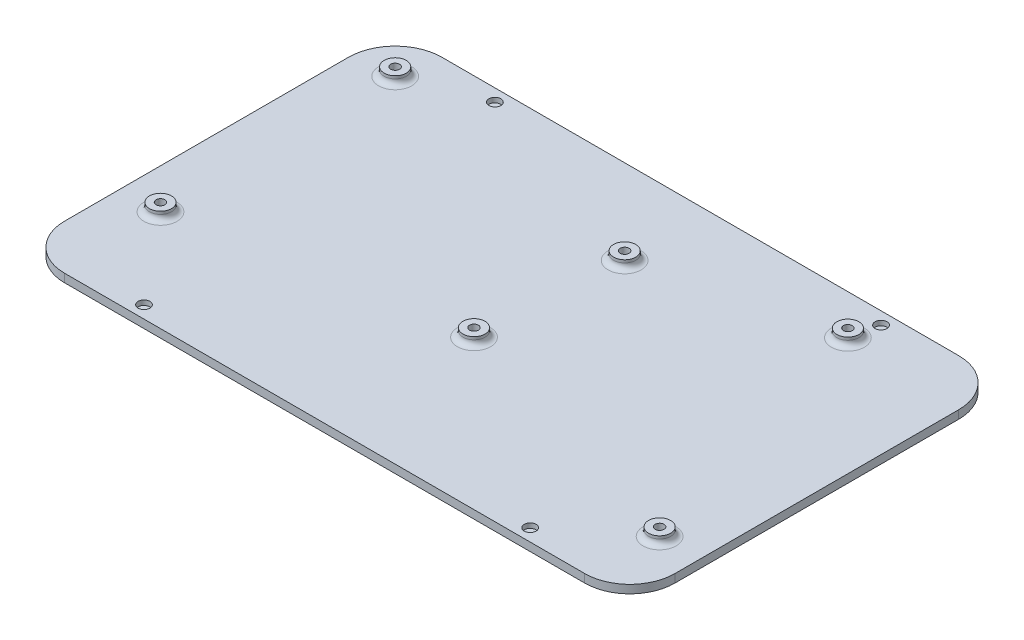
ISO-10303-21;
HEADER;
FILE_DESCRIPTION(('STEP AP214'),'2;1');
FILE_NAME('part.step','',(''),(''),'','','');
FILE_SCHEMA(('AUTOMOTIVE_DESIGN { 1 0 10303 214 1 1 1 1 }'));
ENDSEC;
DATA;
#1=APPLICATION_CONTEXT('core data for automotive mechanical design processes');
#2=APPLICATION_PROTOCOL_DEFINITION('international standard','automotive_design',2000,#1);
#3=PRODUCT_CONTEXT('',#1,'mechanical');
#4=PRODUCT('Part','Part','',(#3));
#5=PRODUCT_RELATED_PRODUCT_CATEGORY('part','',(#4));
#6=PRODUCT_DEFINITION_FORMATION('','',#4);
#7=PRODUCT_DEFINITION_CONTEXT('part definition',#1,'design');
#8=PRODUCT_DEFINITION('design','',#6,#7);
#9=PRODUCT_DEFINITION_SHAPE('','',#8);
#10=(LENGTH_UNIT() NAMED_UNIT(*) SI_UNIT(.MILLI.,.METRE.));
#11=(NAMED_UNIT(*) PLANE_ANGLE_UNIT() SI_UNIT($,.RADIAN.));
#12=(NAMED_UNIT(*) SI_UNIT($,.STERADIAN.) SOLID_ANGLE_UNIT());
#13=UNCERTAINTY_MEASURE_WITH_UNIT(LENGTH_MEASURE(1.E-05),#10,'distance_accuracy_value','');
#14=(GEOMETRIC_REPRESENTATION_CONTEXT(3) GLOBAL_UNCERTAINTY_ASSIGNED_CONTEXT((#13)) GLOBAL_UNIT_ASSIGNED_CONTEXT((#10,
#11,#12)) REPRESENTATION_CONTEXT('',''));
#15=CARTESIAN_POINT('',(0.,0.,0.));
#16=DIRECTION('',(0.,0.,1.));
#17=DIRECTION('',(1.,0.,0.));
#18=AXIS2_PLACEMENT_3D('',#15,#16,#17);
#19=CARTESIAN_POINT('',(-2.85,-2.,-15.24));
#20=DIRECTION('',(0.,-1.,0.));
#21=DIRECTION('',(0.,0.,-1.));
#22=AXIS2_PLACEMENT_3D('',#19,#20,#21);
#23=PLANE('',#22);
#24=CARTESIAN_POINT('',(-4.45,-2.,-15.24));
#25=DIRECTION('',(0.,1.,0.));
#26=DIRECTION('',(0.,0.,1.));
#27=AXIS2_PLACEMENT_3D('',#24,#25,#26);
#28=CIRCLE('',#27,1.6);
#29=CARTESIAN_POINT('',(-4.45,-2.,-13.64));
#30=VERTEX_POINT('',#29);
#31=EDGE_CURVE('E339',#30,#30,#28,.T.);
#32=ORIENTED_EDGE('',*,*,#31,.T.);
#33=EDGE_LOOP('',(#32));
#34=FACE_BOUND('',#33,.T.);
#35=ADVANCED_FACE('F35',(#34),#23,.F.);
#36=CARTESIAN_POINT('',(-4.45,0.,-15.24));
#37=DIRECTION('',(0.,1.,0.));
#38=DIRECTION('',(0.,0.,1.));
#39=AXIS2_PLACEMENT_3D('',#36,#37,#38);
#40=CYLINDRICAL_SURFACE('',#39,1.6);
#41=ORIENTED_EDGE('',*,*,#31,.F.);
#42=EDGE_LOOP('',(#41));
#43=FACE_BOUND('',#42,.T.);
#44=CARTESIAN_POINT('',(-4.45,3.,-15.24));
#45=DIRECTION('',(0.,1.,0.));
#46=DIRECTION('',(0.,0.,1.));
#47=AXIS2_PLACEMENT_3D('',#44,#45,#46);
#48=CIRCLE('',#47,1.6);
#49=CARTESIAN_POINT('',(-4.45,3.,-13.64));
#50=VERTEX_POINT('',#49);
#51=EDGE_CURVE('E436',#50,#50,#48,.T.);
#52=ORIENTED_EDGE('',*,*,#51,.T.);
#53=EDGE_LOOP('',(#52));
#54=FACE_BOUND('',#53,.T.);
#55=ADVANCED_FACE('F191',(#43,#54),#40,.F.);
#56=CARTESIAN_POINT('',(-31.11,-2.,-111.76));
#57=DIRECTION('',(0.,-1.,0.));
#58=DIRECTION('',(0.,0.,-1.));
#59=AXIS2_PLACEMENT_3D('',#56,#57,#58);
#60=PLANE('',#59);
#61=CARTESIAN_POINT('',(-32.71,-2.,-111.76));
#62=DIRECTION('',(0.,1.,0.));
#63=DIRECTION('',(0.,0.,1.));
#64=AXIS2_PLACEMENT_3D('',#61,#62,#63);
#65=CIRCLE('',#64,1.6);
#66=CARTESIAN_POINT('',(-32.71,-2.,-110.16));
#67=VERTEX_POINT('',#66);
#68=EDGE_CURVE('E330',#67,#67,#65,.T.);
#69=ORIENTED_EDGE('',*,*,#68,.T.);
#70=EDGE_LOOP('',(#69));
#71=FACE_BOUND('',#70,.T.);
#72=ADVANCED_FACE('F197',(#71),#60,.F.);
#73=CARTESIAN_POINT('',(-32.71,0.,-111.76));
#74=DIRECTION('',(0.,1.,0.));
#75=DIRECTION('',(0.,0.,1.));
#76=AXIS2_PLACEMENT_3D('',#73,#74,#75);
#77=CYLINDRICAL_SURFACE('',#76,1.6);
#78=ORIENTED_EDGE('',*,*,#68,.F.);
#79=EDGE_LOOP('',(#78));
#80=FACE_BOUND('',#79,.T.);
#81=CARTESIAN_POINT('',(-32.71,3.,-111.76));
#82=DIRECTION('',(0.,1.,0.));
#83=DIRECTION('',(0.,0.,1.));
#84=AXIS2_PLACEMENT_3D('',#81,#82,#83);
#85=CIRCLE('',#84,1.6);
#86=CARTESIAN_POINT('',(-32.71,3.,-110.16));
#87=VERTEX_POINT('',#86);
#88=EDGE_CURVE('E433',#87,#87,#85,.T.);
#89=ORIENTED_EDGE('',*,*,#88,.T.);
#90=EDGE_LOOP('',(#89));
#91=FACE_BOUND('',#90,.T.);
#92=ADVANCED_FACE('F482',(#80,#91),#77,.F.);
#93=CARTESIAN_POINT('',(-95.85,-2.,-95.57));
#94=DIRECTION('',(0.,-1.,0.));
#95=DIRECTION('',(0.,0.,-1.));
#96=AXIS2_PLACEMENT_3D('',#93,#94,#95);
#97=PLANE('',#96);
#98=CARTESIAN_POINT('',(-97.45,-2.,-95.57));
#99=DIRECTION('',(0.,1.,0.));
#100=DIRECTION('',(0.,0.,1.));
#101=AXIS2_PLACEMENT_3D('',#98,#99,#100);
#102=CIRCLE('',#101,1.6);
#103=CARTESIAN_POINT('',(-97.45,-2.,-93.97));
#104=VERTEX_POINT('',#103);
#105=EDGE_CURVE('E333',#104,#104,#102,.T.);
#106=ORIENTED_EDGE('',*,*,#105,.T.);
#107=EDGE_LOOP('',(#106));
#108=FACE_BOUND('',#107,.T.);
#109=ADVANCED_FACE('F486',(#108),#97,.F.);
#110=CARTESIAN_POINT('',(-97.45,0.,-95.57));
#111=DIRECTION('',(0.,1.,0.));
#112=DIRECTION('',(0.,0.,1.));
#113=AXIS2_PLACEMENT_3D('',#110,#111,#112);
#114=CYLINDRICAL_SURFACE('',#113,1.6);
#115=ORIENTED_EDGE('',*,*,#105,.F.);
#116=EDGE_LOOP('',(#115));
#117=FACE_BOUND('',#116,.T.);
#118=CARTESIAN_POINT('',(-97.45,3.,-95.57));
#119=DIRECTION('',(0.,1.,0.));
#120=DIRECTION('',(0.,0.,1.));
#121=AXIS2_PLACEMENT_3D('',#118,#119,#120);
#122=CIRCLE('',#121,1.6);
#123=CARTESIAN_POINT('',(-97.45,3.,-93.97));
#124=VERTEX_POINT('',#123);
#125=EDGE_CURVE('E430',#124,#124,#122,.T.);
#126=ORIENTED_EDGE('',*,*,#125,.T.);
#127=EDGE_LOOP('',(#126));
#128=FACE_BOUND('',#127,.T.);
#129=ADVANCED_FACE('F490',(#117,#128),#114,.F.);
#130=CARTESIAN_POINT('',(-99.03,-2.,-44.13));
#131=DIRECTION('',(0.,-1.,0.));
#132=DIRECTION('',(0.,0.,-1.));
#133=AXIS2_PLACEMENT_3D('',#130,#131,#132);
#134=PLANE('',#133);
#135=CARTESIAN_POINT('',(-100.63,-2.,-44.13));
#136=DIRECTION('',(0.,1.,0.));
#137=DIRECTION('',(0.,0.,1.));
#138=AXIS2_PLACEMENT_3D('',#135,#136,#137);
#139=CIRCLE('',#138,1.6);
#140=CARTESIAN_POINT('',(-100.63,-2.,-42.53));
#141=VERTEX_POINT('',#140);
#142=EDGE_CURVE('E336',#141,#141,#139,.T.);
#143=ORIENTED_EDGE('',*,*,#142,.T.);
#144=EDGE_LOOP('',(#143));
#145=FACE_BOUND('',#144,.T.);
#146=ADVANCED_FACE('F493',(#145),#134,.F.);
#147=CARTESIAN_POINT('',(-100.63,0.,-44.13));
#148=DIRECTION('',(0.,1.,0.));
#149=DIRECTION('',(0.,0.,1.));
#150=AXIS2_PLACEMENT_3D('',#147,#148,#149);
#151=CYLINDRICAL_SURFACE('',#150,1.6);
#152=ORIENTED_EDGE('',*,*,#142,.F.);
#153=EDGE_LOOP('',(#152));
#154=FACE_BOUND('',#153,.T.);
#155=CARTESIAN_POINT('',(-100.63,3.,-44.13));
#156=DIRECTION('',(0.,1.,0.));
#157=DIRECTION('',(0.,0.,1.));
#158=AXIS2_PLACEMENT_3D('',#155,#156,#157);
#159=CIRCLE('',#158,1.6);
#160=CARTESIAN_POINT('',(-100.63,3.,-42.53));
#161=VERTEX_POINT('',#160);
#162=EDGE_CURVE('E425',#161,#161,#159,.T.);
#163=ORIENTED_EDGE('',*,*,#162,.T.);
#164=EDGE_LOOP('',(#163));
#165=FACE_BOUND('',#164,.T.);
#166=ADVANCED_FACE('F202',(#154,#165),#151,.F.);
#167=CARTESIAN_POINT('',(-195.23,-2.,-111.76));
#168=DIRECTION('',(0.,-1.,0.));
#169=DIRECTION('',(0.,0.,-1.));
#170=AXIS2_PLACEMENT_3D('',#167,#168,#169);
#171=PLANE('',#170);
#172=CARTESIAN_POINT('',(-196.83,-2.,-111.76));
#173=DIRECTION('',(0.,1.,0.));
#174=DIRECTION('',(0.,0.,1.));
#175=AXIS2_PLACEMENT_3D('',#172,#173,#174);
#176=CIRCLE('',#175,1.59999999999999);
#177=CARTESIAN_POINT('',(-196.83,-2.,-110.16));
#178=VERTEX_POINT('',#177);
#179=EDGE_CURVE('E327',#178,#178,#176,.T.);
#180=ORIENTED_EDGE('',*,*,#179,.T.);
#181=EDGE_LOOP('',(#180));
#182=FACE_BOUND('',#181,.T.);
#183=ADVANCED_FACE('F473',(#182),#171,.F.);
#184=CARTESIAN_POINT('',(-196.83,0.,-111.76));
#185=DIRECTION('',(0.,1.,0.));
#186=DIRECTION('',(0.,0.,1.));
#187=AXIS2_PLACEMENT_3D('',#184,#185,#186);
#188=CYLINDRICAL_SURFACE('',#187,1.59999999999999);
#189=ORIENTED_EDGE('',*,*,#179,.F.);
#190=EDGE_LOOP('',(#189));
#191=FACE_BOUND('',#190,.T.);
#192=CARTESIAN_POINT('',(-196.83,3.,-111.76));
#193=DIRECTION('',(0.,1.,0.));
#194=DIRECTION('',(0.,0.,1.));
#195=AXIS2_PLACEMENT_3D('',#192,#193,#194);
#196=CIRCLE('',#195,1.59999999999999);
#197=CARTESIAN_POINT('',(-196.83,3.,-110.16));
#198=VERTEX_POINT('',#197);
#199=EDGE_CURVE('E423',#198,#198,#196,.T.);
#200=ORIENTED_EDGE('',*,*,#199,.T.);
#201=EDGE_LOOP('',(#200));
#202=FACE_BOUND('',#201,.T.);
#203=ADVANCED_FACE('F273',(#191,#202),#188,.F.);
#204=CARTESIAN_POINT('',(-6.35,259.842264653001,-6.35));
#205=DIRECTION('',(0.,-1.,0.));
#206=DIRECTION('',(0.,0.,-1.));
#207=AXIS2_PLACEMENT_3D('',#204,#205,#206);
#208=CYLINDRICAL_SURFACE('',#207,16.35);
#209=DIRECTION('',(0.,-1.,0.));
#210=VECTOR('',#209,1.);
#211=CARTESIAN_POINT('',(10.,259.842264653001,-6.35));
#212=LINE('',#211,#210);
#213=CARTESIAN_POINT('',(10.,0.,-6.34999999999999));
#214=VERTEX_POINT('',#213);
#215=CARTESIAN_POINT('',(10.,-3.,-6.35));
#216=VERTEX_POINT('',#215);
#217=EDGE_CURVE('E126',#214,#216,#212,.T.);
#218=ORIENTED_EDGE('',*,*,#217,.F.);
#219=CARTESIAN_POINT('',(-6.35,0.,-6.35));
#220=DIRECTION('',(0.,1.,0.));
#221=DIRECTION('',(0.,0.,1.));
#222=AXIS2_PLACEMENT_3D('',#219,#220,#221);
#223=CIRCLE('',#222,16.35);
#224=CARTESIAN_POINT('',(-6.35,0.,10.));
#225=VERTEX_POINT('',#224);
#226=EDGE_CURVE('E139',#214,#225,#223,.F.);
#227=ORIENTED_EDGE('',*,*,#226,.T.);
#228=DIRECTION('',(0.,-1.,0.));
#229=VECTOR('',#228,1.);
#230=CARTESIAN_POINT('',(-6.35,259.842264653001,10.));
#231=LINE('',#230,#229);
#232=CARTESIAN_POINT('',(-6.35,-3.,10.));
#233=VERTEX_POINT('',#232);
#234=EDGE_CURVE('E137',#225,#233,#231,.T.);
#235=ORIENTED_EDGE('',*,*,#234,.T.);
#236=CARTESIAN_POINT('',(-6.35,-3.,-6.35));
#237=DIRECTION('',(0.,-1.,0.));
#238=DIRECTION('',(0.,0.,-1.));
#239=AXIS2_PLACEMENT_3D('',#236,#237,#238);
#240=CIRCLE('',#239,16.35);
#241=EDGE_CURVE('E136',#216,#233,#240,.T.);
#242=ORIENTED_EDGE('',*,*,#241,.F.);
#243=EDGE_LOOP('',(#218,#227,#235,#242));
#244=FACE_BOUND('',#243,.T.);
#245=ADVANCED_FACE('F269',(#244),#208,.T.);
#246=CARTESIAN_POINT('',(10.,259.842264653001,-109.23));
#247=DIRECTION('',(1.,0.,0.));
#248=DIRECTION('',(0.,0.,-1.));
#249=AXIS2_PLACEMENT_3D('',#246,#247,#248);
#250=PLANE('',#249);
#251=DIRECTION('',(0.,-1.,0.));
#252=VECTOR('',#251,1.);
#253=CARTESIAN_POINT('',(10.,259.842264653001,-109.23));
#254=LINE('',#253,#252);
#255=CARTESIAN_POINT('',(10.,0.,-109.23));
#256=VERTEX_POINT('',#255);
#257=CARTESIAN_POINT('',(10.,-3.,-109.23));
#258=VERTEX_POINT('',#257);
#259=EDGE_CURVE('E130',#256,#258,#254,.T.);
#260=ORIENTED_EDGE('',*,*,#259,.F.);
#261=DIRECTION('',(0.,0.,1.));
#262=VECTOR('',#261,1.);
#263=CARTESIAN_POINT('',(10.,0.,-109.23));
#264=LINE('',#263,#262);
#265=EDGE_CURVE('E129',#256,#214,#264,.T.);
#266=ORIENTED_EDGE('',*,*,#265,.T.);
#267=ORIENTED_EDGE('',*,*,#217,.T.);
#268=DIRECTION('',(0.,0.,1.));
#269=VECTOR('',#268,1.);
#270=CARTESIAN_POINT('',(10.,-3.,-109.23));
#271=LINE('',#270,#269);
#272=EDGE_CURVE('E144',#258,#216,#271,.T.);
#273=ORIENTED_EDGE('',*,*,#272,.F.);
#274=EDGE_LOOP('',(#260,#266,#267,#273));
#275=FACE_BOUND('',#274,.T.);
#276=ADVANCED_FACE('F265',(#275),#250,.T.);
#277=CARTESIAN_POINT('',(-6.98,259.842264653001,-109.23));
#278=DIRECTION('',(0.,-1.,0.));
#279=DIRECTION('',(0.,0.,-1.));
#280=AXIS2_PLACEMENT_3D('',#277,#278,#279);
#281=CYLINDRICAL_SURFACE('',#280,16.98);
#282=DIRECTION('',(0.,-1.,0.));
#283=VECTOR('',#282,1.);
#284=CARTESIAN_POINT('',(-6.98,259.842264653001,-126.21));
#285=LINE('',#284,#283);
#286=CARTESIAN_POINT('',(-6.98000000000001,0.,-126.21));
#287=VERTEX_POINT('',#286);
#288=CARTESIAN_POINT('',(-6.98,-3.,-126.21));
#289=VERTEX_POINT('',#288);
#290=EDGE_CURVE('E108',#287,#289,#285,.T.);
#291=ORIENTED_EDGE('',*,*,#290,.F.);
#292=CARTESIAN_POINT('',(-6.98,0.,-109.23));
#293=DIRECTION('',(0.,1.,0.));
#294=DIRECTION('',(0.,0.,1.));
#295=AXIS2_PLACEMENT_3D('',#292,#293,#294);
#296=CIRCLE('',#295,16.98);
#297=EDGE_CURVE('E128',#287,#256,#296,.F.);
#298=ORIENTED_EDGE('',*,*,#297,.T.);
#299=ORIENTED_EDGE('',*,*,#259,.T.);
#300=CARTESIAN_POINT('',(-6.98,-3.,-109.23));
#301=DIRECTION('',(0.,-1.,0.));
#302=DIRECTION('',(0.,0.,-1.));
#303=AXIS2_PLACEMENT_3D('',#300,#301,#302);
#304=CIRCLE('',#303,16.98);
#305=EDGE_CURVE('E370',#289,#258,#304,.T.);
#306=ORIENTED_EDGE('',*,*,#305,.F.);
#307=EDGE_LOOP('',(#291,#298,#299,#306));
#308=FACE_BOUND('',#307,.T.);
#309=ADVANCED_FACE('F261',(#308),#281,.T.);
#310=CARTESIAN_POINT('',(-194.3,259.842264653001,-126.21));
#311=DIRECTION('',(0.,0.,-1.));
#312=DIRECTION('',(-1.,0.,0.));
#313=AXIS2_PLACEMENT_3D('',#310,#311,#312);
#314=PLANE('',#313);
#315=DIRECTION('',(0.,-1.,0.));
#316=VECTOR('',#315,1.);
#317=CARTESIAN_POINT('',(-194.3,259.842264653001,-126.21));
#318=LINE('',#317,#316);
#319=CARTESIAN_POINT('',(-194.3,0.,-126.21));
#320=VERTEX_POINT('',#319);
#321=CARTESIAN_POINT('',(-194.3,-3.,-126.21));
#322=VERTEX_POINT('',#321);
#323=EDGE_CURVE('E107',#320,#322,#318,.T.);
#324=ORIENTED_EDGE('',*,*,#323,.F.);
#325=DIRECTION('',(1.,0.,0.));
#326=VECTOR('',#325,1.);
#327=CARTESIAN_POINT('',(-194.3,0.,-126.21));
#328=LINE('',#327,#326);
#329=EDGE_CURVE('E104',#320,#287,#328,.T.);
#330=ORIENTED_EDGE('',*,*,#329,.T.);
#331=ORIENTED_EDGE('',*,*,#290,.T.);
#332=DIRECTION('',(1.,0.,0.));
#333=VECTOR('',#332,1.);
#334=CARTESIAN_POINT('',(-194.3,-3.,-126.21));
#335=LINE('',#334,#333);
#336=EDGE_CURVE('E373',#322,#289,#335,.T.);
#337=ORIENTED_EDGE('',*,*,#336,.F.);
#338=EDGE_LOOP('',(#324,#330,#331,#337));
#339=FACE_BOUND('',#338,.T.);
#340=ADVANCED_FACE('F258',(#339),#314,.T.);
#341=CARTESIAN_POINT('',(-194.3,259.842264653001,-109.23));
#342=DIRECTION('',(0.,-1.,0.));
#343=DIRECTION('',(0.,0.,-1.));
#344=AXIS2_PLACEMENT_3D('',#341,#342,#343);
#345=CYLINDRICAL_SURFACE('',#344,16.98);
#346=DIRECTION('',(0.,-1.,0.));
#347=VECTOR('',#346,1.);
#348=CARTESIAN_POINT('',(-211.28,259.842264653001,-109.23));
#349=LINE('',#348,#347);
#350=CARTESIAN_POINT('',(-211.28,0.,-109.23));
#351=VERTEX_POINT('',#350);
#352=CARTESIAN_POINT('',(-211.28,-3.,-109.23));
#353=VERTEX_POINT('',#352);
#354=EDGE_CURVE('E111',#351,#353,#349,.T.);
#355=ORIENTED_EDGE('',*,*,#354,.F.);
#356=CARTESIAN_POINT('',(-194.3,0.,-109.23));
#357=DIRECTION('',(0.,1.,0.));
#358=DIRECTION('',(0.,0.,1.));
#359=AXIS2_PLACEMENT_3D('',#356,#357,#358);
#360=CIRCLE('',#359,16.98);
#361=EDGE_CURVE('E97',#351,#320,#360,.F.);
#362=ORIENTED_EDGE('',*,*,#361,.T.);
#363=ORIENTED_EDGE('',*,*,#323,.T.);
#364=CARTESIAN_POINT('',(-194.3,-3.,-109.23));
#365=DIRECTION('',(0.,-1.,0.));
#366=DIRECTION('',(0.,0.,-1.));
#367=AXIS2_PLACEMENT_3D('',#364,#365,#366);
#368=CIRCLE('',#367,16.98);
#369=EDGE_CURVE('E114',#353,#322,#368,.T.);
#370=ORIENTED_EDGE('',*,*,#369,.F.);
#371=EDGE_LOOP('',(#355,#362,#363,#370));
#372=FACE_BOUND('',#371,.T.);
#373=ADVANCED_FACE('F112',(#372),#345,.T.);
#374=CARTESIAN_POINT('',(-211.28,259.842264653001,-6.34999999999998));
#375=DIRECTION('',(-1.,0.,0.));
#376=DIRECTION('',(0.,0.,1.));
#377=AXIS2_PLACEMENT_3D('',#374,#375,#376);
#378=PLANE('',#377);
#379=DIRECTION('',(0.,-1.,0.));
#380=VECTOR('',#379,1.);
#381=CARTESIAN_POINT('',(-211.28,259.842264653001,-6.34999999999998));
#382=LINE('',#381,#380);
#383=CARTESIAN_POINT('',(-211.28,0.,-6.34999999999998));
#384=VERTEX_POINT('',#383);
#385=CARTESIAN_POINT('',(-211.28,-3.,-6.34999999999998));
#386=VERTEX_POINT('',#385);
#387=EDGE_CURVE('E120',#384,#386,#382,.T.);
#388=ORIENTED_EDGE('',*,*,#387,.F.);
#389=DIRECTION('',(0.,0.,-1.));
#390=VECTOR('',#389,1.);
#391=CARTESIAN_POINT('',(-211.28,0.,-6.34999999999998));
#392=LINE('',#391,#390);
#393=EDGE_CURVE('E101',#384,#351,#392,.T.);
#394=ORIENTED_EDGE('',*,*,#393,.T.);
#395=ORIENTED_EDGE('',*,*,#354,.T.);
#396=DIRECTION('',(0.,0.,-1.));
#397=VECTOR('',#396,1.);
#398=CARTESIAN_POINT('',(-211.28,-3.,-6.34999999999998));
#399=LINE('',#398,#397);
#400=EDGE_CURVE('E377',#386,#353,#399,.T.);
#401=ORIENTED_EDGE('',*,*,#400,.F.);
#402=EDGE_LOOP('',(#388,#394,#395,#401));
#403=FACE_BOUND('',#402,.T.);
#404=ADVANCED_FACE('F119',(#403),#378,.T.);
#405=CARTESIAN_POINT('',(-194.93,259.842264653001,-6.34999999999998));
#406=DIRECTION('',(0.,-1.,0.));
#407=DIRECTION('',(0.,0.,-1.));
#408=AXIS2_PLACEMENT_3D('',#405,#406,#407);
#409=CYLINDRICAL_SURFACE('',#408,16.35);
#410=DIRECTION('',(0.,-1.,0.));
#411=VECTOR('',#410,1.);
#412=CARTESIAN_POINT('',(-194.93,259.842264653001,10.));
#413=LINE('',#412,#411);
#414=CARTESIAN_POINT('',(-194.93,0.,10.));
#415=VERTEX_POINT('',#414);
#416=CARTESIAN_POINT('',(-194.93,-3.,10.));
#417=VERTEX_POINT('',#416);
#418=EDGE_CURVE('E134',#415,#417,#413,.T.);
#419=ORIENTED_EDGE('',*,*,#418,.F.);
#420=CARTESIAN_POINT('',(-194.93,0.,-6.34999999999998));
#421=DIRECTION('',(0.,1.,0.));
#422=DIRECTION('',(0.,0.,1.));
#423=AXIS2_PLACEMENT_3D('',#420,#421,#422);
#424=CIRCLE('',#423,16.35);
#425=EDGE_CURVE('E56',#415,#384,#424,.F.);
#426=ORIENTED_EDGE('',*,*,#425,.T.);
#427=ORIENTED_EDGE('',*,*,#387,.T.);
#428=CARTESIAN_POINT('',(-194.93,-3.,-6.34999999999998));
#429=DIRECTION('',(0.,-1.,0.));
#430=DIRECTION('',(0.,0.,-1.));
#431=AXIS2_PLACEMENT_3D('',#428,#429,#430);
#432=CIRCLE('',#431,16.35);
#433=EDGE_CURVE('E379',#417,#386,#432,.T.);
#434=ORIENTED_EDGE('',*,*,#433,.F.);
#435=EDGE_LOOP('',(#419,#426,#427,#434));
#436=FACE_BOUND('',#435,.T.);
#437=ADVANCED_FACE('F249',(#436),#409,.T.);
#438=CARTESIAN_POINT('',(-6.35,259.842264653001,10.));
#439=DIRECTION('',(0.,0.,1.));
#440=DIRECTION('',(1.,0.,0.));
#441=AXIS2_PLACEMENT_3D('',#438,#439,#440);
#442=PLANE('',#441);
#443=ORIENTED_EDGE('',*,*,#234,.F.);
#444=DIRECTION('',(-1.,0.,0.));
#445=VECTOR('',#444,1.);
#446=CARTESIAN_POINT('',(-6.35,0.,10.));
#447=LINE('',#446,#445);
#448=EDGE_CURVE('E50',#225,#415,#447,.T.);
#449=ORIENTED_EDGE('',*,*,#448,.T.);
#450=ORIENTED_EDGE('',*,*,#418,.T.);
#451=DIRECTION('',(-1.,0.,0.));
#452=VECTOR('',#451,1.);
#453=CARTESIAN_POINT('',(-6.35,-3.,10.));
#454=LINE('',#453,#452);
#455=EDGE_CURVE('E382',#233,#417,#454,.T.);
#456=ORIENTED_EDGE('',*,*,#455,.F.);
#457=EDGE_LOOP('',(#443,#449,#450,#456));
#458=FACE_BOUND('',#457,.T.);
#459=ADVANCED_FACE('F246',(#458),#442,.T.);
#460=CARTESIAN_POINT('',(0.,0.,0.));
#461=DIRECTION('',(0.,1.,0.));
#462=DIRECTION('',(0.,0.,1.));
#463=AXIS2_PLACEMENT_3D('',#460,#461,#462);
#464=PLANE('',#463);
#465=CARTESIAN_POINT('',(-32.71,0.,-111.76));
#466=DIRECTION('',(0.,1.,0.));
#467=DIRECTION('',(0.,0.,1.));
#468=AXIS2_PLACEMENT_3D('',#465,#466,#467);
#469=CIRCLE('',#468,6.);
#470=CARTESIAN_POINT('',(-32.71,0.,-105.76));
#471=VERTEX_POINT('',#470);
#472=EDGE_CURVE('E159',#471,#471,#469,.F.);
#473=ORIENTED_EDGE('',*,*,#472,.T.);
#474=EDGE_LOOP('',(#473));
#475=FACE_BOUND('',#474,.T.);
#476=CARTESIAN_POINT('',(-4.45,0.,-15.24));
#477=DIRECTION('',(0.,1.,0.));
#478=DIRECTION('',(0.,0.,1.));
#479=AXIS2_PLACEMENT_3D('',#476,#477,#478);
#480=CIRCLE('',#479,6.);
#481=CARTESIAN_POINT('',(-4.45,0.,-9.24));
#482=VERTEX_POINT('',#481);
#483=EDGE_CURVE('E156',#482,#482,#480,.F.);
#484=ORIENTED_EDGE('',*,*,#483,.T.);
#485=EDGE_LOOP('',(#484));
#486=FACE_BOUND('',#485,.T.);
#487=CARTESIAN_POINT('',(-97.45,0.,-95.57));
#488=DIRECTION('',(0.,1.,0.));
#489=DIRECTION('',(0.,0.,1.));
#490=AXIS2_PLACEMENT_3D('',#487,#488,#489);
#491=CIRCLE('',#490,6.00000000000001);
#492=CARTESIAN_POINT('',(-97.45,0.,-89.57));
#493=VERTEX_POINT('',#492);
#494=EDGE_CURVE('E153',#493,#493,#491,.F.);
#495=ORIENTED_EDGE('',*,*,#494,.T.);
#496=EDGE_LOOP('',(#495));
#497=FACE_BOUND('',#496,.T.);
#498=CARTESIAN_POINT('',(-100.63,0.,-44.13));
#499=DIRECTION('',(0.,1.,0.));
#500=DIRECTION('',(0.,0.,1.));
#501=AXIS2_PLACEMENT_3D('',#498,#499,#500);
#502=CIRCLE('',#501,6.00000000000001);
#503=CARTESIAN_POINT('',(-100.63,0.,-38.13));
#504=VERTEX_POINT('',#503);
#505=EDGE_CURVE('E150',#504,#504,#502,.F.);
#506=ORIENTED_EDGE('',*,*,#505,.T.);
#507=EDGE_LOOP('',(#506));
#508=FACE_BOUND('',#507,.T.);
#509=CARTESIAN_POINT('',(-196.83,0.,-26.67));
#510=DIRECTION('',(0.,1.,0.));
#511=DIRECTION('',(0.,0.,1.));
#512=AXIS2_PLACEMENT_3D('',#509,#510,#511);
#513=CIRCLE('',#512,5.99999999999999);
#514=CARTESIAN_POINT('',(-196.83,0.,-20.67));
#515=VERTEX_POINT('',#514);
#516=EDGE_CURVE('E147',#515,#515,#513,.F.);
#517=ORIENTED_EDGE('',*,*,#516,.T.);
#518=EDGE_LOOP('',(#517));
#519=FACE_BOUND('',#518,.T.);
#520=CARTESIAN_POINT('',(-196.83,0.,-111.76));
#521=DIRECTION('',(0.,1.,0.));
#522=DIRECTION('',(0.,0.,1.));
#523=AXIS2_PLACEMENT_3D('',#520,#521,#522);
#524=CIRCLE('',#523,5.99999999999999);
#525=CARTESIAN_POINT('',(-196.83,0.,-105.76));
#526=VERTEX_POINT('',#525);
#527=EDGE_CURVE('E143',#526,#526,#524,.F.);
#528=ORIENTED_EDGE('',*,*,#527,.T.);
#529=EDGE_LOOP('',(#528));
#530=FACE_BOUND('',#529,.T.);
#531=CARTESIAN_POINT('',(-170.64,0.,5.50000000000002));
#532=DIRECTION('',(0.,1.,0.));
#533=DIRECTION('',(0.,0.,-1.));
#534=AXIS2_PLACEMENT_3D('',#531,#532,#533);
#535=CIRCLE('',#534,2.15000000000002);
#536=CARTESIAN_POINT('',(-170.64,0.,3.35));
#537=VERTEX_POINT('',#536);
#538=EDGE_CURVE('E344',#537,#537,#535,.T.);
#539=ORIENTED_EDGE('',*,*,#538,.F.);
#540=EDGE_LOOP('',(#539));
#541=FACE_BOUND('',#540,.T.);
#542=CARTESIAN_POINT('',(-30.64,0.,5.50000000000002));
#543=DIRECTION('',(0.,1.,0.));
#544=DIRECTION('',(0.,0.,1.));
#545=AXIS2_PLACEMENT_3D('',#542,#543,#544);
#546=CIRCLE('',#545,2.15);
#547=CARTESIAN_POINT('',(-30.64,0.,7.65000000000001));
#548=VERTEX_POINT('',#547);
#549=EDGE_CURVE('E348',#548,#548,#546,.T.);
#550=ORIENTED_EDGE('',*,*,#549,.F.);
#551=EDGE_LOOP('',(#550));
#552=FACE_BOUND('',#551,.T.);
#553=CARTESIAN_POINT('',(-170.64,0.,-121.71));
#554=DIRECTION('',(0.,1.,0.));
#555=DIRECTION('',(0.,0.,1.));
#556=AXIS2_PLACEMENT_3D('',#553,#554,#555);
#557=CIRCLE('',#556,2.15000000000001);
#558=CARTESIAN_POINT('',(-170.64,0.,-119.56));
#559=VERTEX_POINT('',#558);
#560=EDGE_CURVE('E354',#559,#559,#557,.T.);
#561=ORIENTED_EDGE('',*,*,#560,.F.);
#562=EDGE_LOOP('',(#561));
#563=FACE_BOUND('',#562,.T.);
#564=CARTESIAN_POINT('',(-30.64,0.,-121.71));
#565=DIRECTION('',(0.,1.,0.));
#566=DIRECTION('',(0.,0.,-1.));
#567=AXIS2_PLACEMENT_3D('',#564,#565,#566);
#568=CIRCLE('',#567,2.15);
#569=CARTESIAN_POINT('',(-30.64,0.,-123.86));
#570=VERTEX_POINT('',#569);
#571=EDGE_CURVE('E360',#570,#570,#568,.T.);
#572=ORIENTED_EDGE('',*,*,#571,.F.);
#573=EDGE_LOOP('',(#572));
#574=FACE_BOUND('',#573,.T.);
#575=ORIENTED_EDGE('',*,*,#226,.F.);
#576=ORIENTED_EDGE('',*,*,#265,.F.);
#577=ORIENTED_EDGE('',*,*,#297,.F.);
#578=ORIENTED_EDGE('',*,*,#329,.F.);
#579=ORIENTED_EDGE('',*,*,#361,.F.);
#580=ORIENTED_EDGE('',*,*,#393,.F.);
#581=ORIENTED_EDGE('',*,*,#425,.F.);
#582=ORIENTED_EDGE('',*,*,#448,.F.);
#583=EDGE_LOOP('',(#575,#576,#577,#578,#579,#580,#581,#582));
#584=FACE_BOUND('',#583,.T.);
#585=ADVANCED_FACE('F99',(#475,#486,#497,#508,#519,#530,#541,#552,#563,#574,#584),#464,.T.);
#586=CARTESIAN_POINT('',(0.,-3.,0.));
#587=DIRECTION('',(0.,1.,0.));
#588=DIRECTION('',(0.,0.,1.));
#589=AXIS2_PLACEMENT_3D('',#586,#587,#588);
#590=PLANE('',#589);
#591=ORIENTED_EDGE('',*,*,#241,.T.);
#592=ORIENTED_EDGE('',*,*,#455,.T.);
#593=ORIENTED_EDGE('',*,*,#433,.T.);
#594=ORIENTED_EDGE('',*,*,#400,.T.);
#595=ORIENTED_EDGE('',*,*,#369,.T.);
#596=ORIENTED_EDGE('',*,*,#336,.T.);
#597=ORIENTED_EDGE('',*,*,#305,.T.);
#598=ORIENTED_EDGE('',*,*,#272,.T.);
#599=EDGE_LOOP('',(#591,#592,#593,#594,#595,#596,#597,#598));
#600=FACE_BOUND('',#599,.T.);
#601=ADVANCED_FACE('F244',(#600),#590,.F.);
#602=CARTESIAN_POINT('',(-30.64,-1.75,-121.71));
#603=DIRECTION('',(0.,1.,0.));
#604=DIRECTION('',(0.,0.,1.));
#605=AXIS2_PLACEMENT_3D('',#602,#603,#604);
#606=CYLINDRICAL_SURFACE('',#605,2.15);
#607=CARTESIAN_POINT('',(-30.64,-1.75,-121.71));
#608=DIRECTION('',(0.,1.,0.));
#609=DIRECTION('',(0.,0.,-1.));
#610=AXIS2_PLACEMENT_3D('',#607,#608,#609);
#611=CIRCLE('',#610,2.15);
#612=CARTESIAN_POINT('',(-30.64,-1.75,-123.86));
#613=VERTEX_POINT('',#612);
#614=EDGE_CURVE('E363',#613,#613,#611,.T.);
#615=ORIENTED_EDGE('',*,*,#614,.F.);
#616=EDGE_LOOP('',(#615));
#617=FACE_BOUND('',#616,.T.);
#618=ORIENTED_EDGE('',*,*,#571,.T.);
#619=EDGE_LOOP('',(#618));
#620=FACE_BOUND('',#619,.T.);
#621=ADVANCED_FACE('F240',(#617,#620),#606,.F.);
#622=CARTESIAN_POINT('',(-30.64,-1.75,-121.71));
#623=DIRECTION('',(0.,-1.,0.));
#624=DIRECTION('',(0.,0.,-1.));
#625=AXIS2_PLACEMENT_3D('',#622,#623,#624);
#626=PLANE('',#625);
#627=ORIENTED_EDGE('',*,*,#614,.T.);
#628=EDGE_LOOP('',(#627));
#629=FACE_BOUND('',#628,.T.);
#630=ADVANCED_FACE('F236',(#629),#626,.F.);
#631=CARTESIAN_POINT('',(-170.64,-1.75,-121.71));
#632=DIRECTION('',(0.,1.,0.));
#633=DIRECTION('',(0.,0.,1.));
#634=AXIS2_PLACEMENT_3D('',#631,#632,#633);
#635=CYLINDRICAL_SURFACE('',#634,2.15000000000001);
#636=CARTESIAN_POINT('',(-170.64,-1.75,-121.71));
#637=DIRECTION('',(0.,1.,0.));
#638=DIRECTION('',(0.,0.,1.));
#639=AXIS2_PLACEMENT_3D('',#636,#637,#638);
#640=CIRCLE('',#639,2.15000000000001);
#641=CARTESIAN_POINT('',(-170.64,-1.75,-119.56));
#642=VERTEX_POINT('',#641);
#643=EDGE_CURVE('E357',#642,#642,#640,.T.);
#644=ORIENTED_EDGE('',*,*,#643,.F.);
#645=EDGE_LOOP('',(#644));
#646=FACE_BOUND('',#645,.T.);
#647=ORIENTED_EDGE('',*,*,#560,.T.);
#648=EDGE_LOOP('',(#647));
#649=FACE_BOUND('',#648,.T.);
#650=ADVANCED_FACE('F232',(#646,#649),#635,.F.);
#651=CARTESIAN_POINT('',(-170.64,-1.75,-121.71));
#652=DIRECTION('',(0.,1.,0.));
#653=DIRECTION('',(0.,0.,1.));
#654=AXIS2_PLACEMENT_3D('',#651,#652,#653);
#655=PLANE('',#654);
#656=ORIENTED_EDGE('',*,*,#643,.T.);
#657=EDGE_LOOP('',(#656));
#658=FACE_BOUND('',#657,.T.);
#659=ADVANCED_FACE('F228',(#658),#655,.T.);
#660=CARTESIAN_POINT('',(-30.64,-1.75,5.50000000000002));
#661=DIRECTION('',(0.,1.,0.));
#662=DIRECTION('',(0.,0.,1.));
#663=AXIS2_PLACEMENT_3D('',#660,#661,#662);
#664=CYLINDRICAL_SURFACE('',#663,2.15);
#665=CARTESIAN_POINT('',(-30.64,-1.75,5.50000000000002));
#666=DIRECTION('',(0.,1.,0.));
#667=DIRECTION('',(0.,0.,1.));
#668=AXIS2_PLACEMENT_3D('',#665,#666,#667);
#669=CIRCLE('',#668,2.15);
#670=CARTESIAN_POINT('',(-30.64,-1.75,7.65000000000001));
#671=VERTEX_POINT('',#670);
#672=EDGE_CURVE('E351',#671,#671,#669,.T.);
#673=ORIENTED_EDGE('',*,*,#672,.F.);
#674=EDGE_LOOP('',(#673));
#675=FACE_BOUND('',#674,.T.);
#676=ORIENTED_EDGE('',*,*,#549,.T.);
#677=EDGE_LOOP('',(#676));
#678=FACE_BOUND('',#677,.T.);
#679=ADVANCED_FACE('F224',(#675,#678),#664,.F.);
#680=CARTESIAN_POINT('',(-30.64,-1.75,5.50000000000002));
#681=DIRECTION('',(0.,1.,0.));
#682=DIRECTION('',(0.,0.,1.));
#683=AXIS2_PLACEMENT_3D('',#680,#681,#682);
#684=PLANE('',#683);
#685=ORIENTED_EDGE('',*,*,#672,.T.);
#686=EDGE_LOOP('',(#685));
#687=FACE_BOUND('',#686,.T.);
#688=ADVANCED_FACE('F220',(#687),#684,.T.);
#689=CARTESIAN_POINT('',(-170.64,-1.75,5.50000000000002));
#690=DIRECTION('',(0.,1.,0.));
#691=DIRECTION('',(0.,0.,1.));
#692=AXIS2_PLACEMENT_3D('',#689,#690,#691);
#693=CYLINDRICAL_SURFACE('',#692,2.15000000000002);
#694=CARTESIAN_POINT('',(-170.64,-1.75,5.50000000000002));
#695=DIRECTION('',(0.,1.,0.));
#696=DIRECTION('',(0.,0.,-1.));
#697=AXIS2_PLACEMENT_3D('',#694,#695,#696);
#698=CIRCLE('',#697,2.15000000000002);
#699=CARTESIAN_POINT('',(-170.64,-1.75,3.35));
#700=VERTEX_POINT('',#699);
#701=EDGE_CURVE('E345',#700,#700,#698,.T.);
#702=ORIENTED_EDGE('',*,*,#701,.F.);
#703=EDGE_LOOP('',(#702));
#704=FACE_BOUND('',#703,.T.);
#705=ORIENTED_EDGE('',*,*,#538,.T.);
#706=EDGE_LOOP('',(#705));
#707=FACE_BOUND('',#706,.T.);
#708=ADVANCED_FACE('F216',(#704,#707),#693,.F.);
#709=CARTESIAN_POINT('',(-170.64,-1.75,5.50000000000002));
#710=DIRECTION('',(0.,-1.,0.));
#711=DIRECTION('',(0.,0.,-1.));
#712=AXIS2_PLACEMENT_3D('',#709,#710,#711);
#713=PLANE('',#712);
#714=ORIENTED_EDGE('',*,*,#701,.T.);
#715=EDGE_LOOP('',(#714));
#716=FACE_BOUND('',#715,.T.);
#717=ADVANCED_FACE('F212',(#716),#713,.F.);
#718=CARTESIAN_POINT('',(-196.83,3.,-111.76));
#719=DIRECTION('',(0.,-1.,0.));
#720=DIRECTION('',(0.,0.,-1.));
#721=AXIS2_PLACEMENT_3D('',#718,#719,#720);
#722=CYLINDRICAL_SURFACE('',#721,3.99999999999999);
#723=CARTESIAN_POINT('',(-196.83,2.,-111.76));
#724=DIRECTION('',(0.,1.,0.));
#725=DIRECTION('',(0.,0.,1.));
#726=AXIS2_PLACEMENT_3D('',#723,#724,#725);
#727=CIRCLE('',#726,3.99999999999999);
#728=CARTESIAN_POINT('',(-196.83,2.,-107.76));
#729=VERTEX_POINT('',#728);
#730=EDGE_CURVE('E11',#729,#729,#727,.T.);
#731=ORIENTED_EDGE('',*,*,#730,.T.);
#732=EDGE_LOOP('',(#731));
#733=FACE_BOUND('',#732,.T.);
#734=CARTESIAN_POINT('',(-196.83,3.,-111.76));
#735=DIRECTION('',(0.,1.,0.));
#736=DIRECTION('',(0.,0.,1.));
#737=AXIS2_PLACEMENT_3D('',#734,#735,#736);
#738=CIRCLE('',#737,3.99999999999999);
#739=CARTESIAN_POINT('',(-196.83,3.,-107.76));
#740=VERTEX_POINT('',#739);
#741=EDGE_CURVE('E324',#740,#740,#738,.T.);
#742=ORIENTED_EDGE('',*,*,#741,.F.);
#743=EDGE_LOOP('',(#742));
#744=FACE_BOUND('',#743,.T.);
#745=ADVANCED_FACE('F215',(#733,#744),#722,.T.);
#746=CARTESIAN_POINT('',(-196.83,3.,-111.76));
#747=DIRECTION('',(0.,1.,0.));
#748=DIRECTION('',(0.,0.,1.));
#749=AXIS2_PLACEMENT_3D('',#746,#747,#748);
#750=PLANE('',#749);
#751=ORIENTED_EDGE('',*,*,#199,.F.);
#752=EDGE_LOOP('',(#751));
#753=FACE_BOUND('',#752,.T.);
#754=ORIENTED_EDGE('',*,*,#741,.T.);
#755=EDGE_LOOP('',(#754));
#756=FACE_BOUND('',#755,.T.);
#757=ADVANCED_FACE('F466',(#753,#756),#750,.T.);
#758=CARTESIAN_POINT('',(-196.83,3.,-26.67));
#759=DIRECTION('',(0.,-1.,0.));
#760=DIRECTION('',(0.,0.,-1.));
#761=AXIS2_PLACEMENT_3D('',#758,#759,#760);
#762=CYLINDRICAL_SURFACE('',#761,3.99999999999999);
#763=CARTESIAN_POINT('',(-196.83,2.,-26.67));
#764=DIRECTION('',(0.,1.,0.));
#765=DIRECTION('',(0.,0.,1.));
#766=AXIS2_PLACEMENT_3D('',#763,#764,#765);
#767=CIRCLE('',#766,3.99999999999999);
#768=CARTESIAN_POINT('',(-196.83,2.,-22.67));
#769=VERTEX_POINT('',#768);
#770=EDGE_CURVE('E43',#769,#769,#767,.T.);
#771=ORIENTED_EDGE('',*,*,#770,.T.);
#772=EDGE_LOOP('',(#771));
#773=FACE_BOUND('',#772,.T.);
#774=CARTESIAN_POINT('',(-196.83,3.,-26.67));
#775=DIRECTION('',(0.,1.,0.));
#776=DIRECTION('',(0.,0.,1.));
#777=AXIS2_PLACEMENT_3D('',#774,#775,#776);
#778=CIRCLE('',#777,3.99999999999999);
#779=CARTESIAN_POINT('',(-196.83,3.,-22.67));
#780=VERTEX_POINT('',#779);
#781=EDGE_CURVE('E321',#780,#780,#778,.T.);
#782=ORIENTED_EDGE('',*,*,#781,.F.);
#783=EDGE_LOOP('',(#782));
#784=FACE_BOUND('',#783,.T.);
#785=ADVANCED_FACE('F173',(#773,#784),#762,.T.);
#786=CARTESIAN_POINT('',(-196.83,3.,-26.67));
#787=DIRECTION('',(0.,1.,0.));
#788=DIRECTION('',(0.,0.,1.));
#789=AXIS2_PLACEMENT_3D('',#786,#787,#788);
#790=PLANE('',#789);
#791=CARTESIAN_POINT('',(-196.83,3.,-26.67));
#792=DIRECTION('',(0.,1.,0.));
#793=DIRECTION('',(0.,0.,1.));
#794=AXIS2_PLACEMENT_3D('',#791,#792,#793);
#795=CIRCLE('',#794,1.59999999999999);
#796=CARTESIAN_POINT('',(-196.83,3.,-25.07));
#797=VERTEX_POINT('',#796);
#798=EDGE_CURVE('E315',#797,#797,#795,.T.);
#799=ORIENTED_EDGE('',*,*,#798,.F.);
#800=EDGE_LOOP('',(#799));
#801=FACE_BOUND('',#800,.T.);
#802=ORIENTED_EDGE('',*,*,#781,.T.);
#803=EDGE_LOOP('',(#802));
#804=FACE_BOUND('',#803,.T.);
#805=ADVANCED_FACE('F460',(#801,#804),#790,.T.);
#806=CARTESIAN_POINT('',(-100.63,3.,-44.13));
#807=DIRECTION('',(0.,-1.,0.));
#808=DIRECTION('',(0.,0.,-1.));
#809=AXIS2_PLACEMENT_3D('',#806,#807,#808);
#810=CYLINDRICAL_SURFACE('',#809,4.00000000000001);
#811=CARTESIAN_POINT('',(-100.63,2.,-44.13));
#812=DIRECTION('',(0.,1.,0.));
#813=DIRECTION('',(0.,0.,1.));
#814=AXIS2_PLACEMENT_3D('',#811,#812,#813);
#815=CIRCLE('',#814,4.00000000000001);
#816=CARTESIAN_POINT('',(-100.63,2.,-40.13));
#817=VERTEX_POINT('',#816);
#818=EDGE_CURVE('E168',#817,#817,#815,.T.);
#819=ORIENTED_EDGE('',*,*,#818,.T.);
#820=EDGE_LOOP('',(#819));
#821=FACE_BOUND('',#820,.T.);
#822=CARTESIAN_POINT('',(-100.63,3.,-44.13));
#823=DIRECTION('',(0.,1.,0.));
#824=DIRECTION('',(0.,0.,1.));
#825=AXIS2_PLACEMENT_3D('',#822,#823,#824);
#826=CIRCLE('',#825,4.00000000000001);
#827=CARTESIAN_POINT('',(-100.63,3.,-40.13));
#828=VERTEX_POINT('',#827);
#829=EDGE_CURVE('E312',#828,#828,#826,.T.);
#830=ORIENTED_EDGE('',*,*,#829,.F.);
#831=EDGE_LOOP('',(#830));
#832=FACE_BOUND('',#831,.T.);
#833=ADVANCED_FACE('F454',(#821,#832),#810,.T.);
#834=CARTESIAN_POINT('',(-100.63,3.,-44.13));
#835=DIRECTION('',(0.,1.,0.));
#836=DIRECTION('',(0.,0.,1.));
#837=AXIS2_PLACEMENT_3D('',#834,#835,#836);
#838=PLANE('',#837);
#839=ORIENTED_EDGE('',*,*,#162,.F.);
#840=EDGE_LOOP('',(#839));
#841=FACE_BOUND('',#840,.T.);
#842=ORIENTED_EDGE('',*,*,#829,.T.);
#843=EDGE_LOOP('',(#842));
#844=FACE_BOUND('',#843,.T.);
#845=ADVANCED_FACE('F448',(#841,#844),#838,.T.);
#846=CARTESIAN_POINT('',(-4.45,3.,-15.24));
#847=DIRECTION('',(0.,-1.,0.));
#848=DIRECTION('',(0.,0.,-1.));
#849=AXIS2_PLACEMENT_3D('',#846,#847,#848);
#850=CYLINDRICAL_SURFACE('',#849,4.);
#851=CARTESIAN_POINT('',(-4.45,2.,-15.24));
#852=DIRECTION('',(0.,1.,0.));
#853=DIRECTION('',(0.,0.,1.));
#854=AXIS2_PLACEMENT_3D('',#851,#852,#853);
#855=CIRCLE('',#854,4.);
#856=CARTESIAN_POINT('',(-4.45,2.,-11.24));
#857=VERTEX_POINT('',#856);
#858=EDGE_CURVE('E162',#857,#857,#855,.T.);
#859=ORIENTED_EDGE('',*,*,#858,.T.);
#860=EDGE_LOOP('',(#859));
#861=FACE_BOUND('',#860,.T.);
#862=CARTESIAN_POINT('',(-4.45,3.,-15.24));
#863=DIRECTION('',(0.,1.,0.));
#864=DIRECTION('',(0.,0.,1.));
#865=AXIS2_PLACEMENT_3D('',#862,#863,#864);
#866=CIRCLE('',#865,4.);
#867=CARTESIAN_POINT('',(-4.45,3.,-11.24));
#868=VERTEX_POINT('',#867);
#869=EDGE_CURVE('E308',#868,#868,#866,.T.);
#870=ORIENTED_EDGE('',*,*,#869,.F.);
#871=EDGE_LOOP('',(#870));
#872=FACE_BOUND('',#871,.T.);
#873=ADVANCED_FACE('F443',(#861,#872),#850,.T.);
#874=CARTESIAN_POINT('',(-4.45,3.,-15.24));
#875=DIRECTION('',(0.,1.,0.));
#876=DIRECTION('',(0.,0.,1.));
#877=AXIS2_PLACEMENT_3D('',#874,#875,#876);
#878=PLANE('',#877);
#879=ORIENTED_EDGE('',*,*,#51,.F.);
#880=EDGE_LOOP('',(#879));
#881=FACE_BOUND('',#880,.T.);
#882=ORIENTED_EDGE('',*,*,#869,.T.);
#883=EDGE_LOOP('',(#882));
#884=FACE_BOUND('',#883,.T.);
#885=ADVANCED_FACE('F302',(#881,#884),#878,.T.);
#886=CARTESIAN_POINT('',(-97.45,3.,-95.57));
#887=DIRECTION('',(0.,-1.,0.));
#888=DIRECTION('',(0.,0.,-1.));
#889=AXIS2_PLACEMENT_3D('',#886,#887,#888);
#890=CYLINDRICAL_SURFACE('',#889,4.00000000000001);
#891=CARTESIAN_POINT('',(-97.45,2.,-95.57));
#892=DIRECTION('',(0.,1.,0.));
#893=DIRECTION('',(0.,0.,1.));
#894=AXIS2_PLACEMENT_3D('',#891,#892,#893);
#895=CIRCLE('',#894,4.00000000000001);
#896=CARTESIAN_POINT('',(-97.45,2.,-91.57));
#897=VERTEX_POINT('',#896);
#898=EDGE_CURVE('E165',#897,#897,#895,.T.);
#899=ORIENTED_EDGE('',*,*,#898,.T.);
#900=EDGE_LOOP('',(#899));
#901=FACE_BOUND('',#900,.T.);
#902=CARTESIAN_POINT('',(-97.45,3.,-95.57));
#903=DIRECTION('',(0.,1.,0.));
#904=DIRECTION('',(0.,0.,1.));
#905=AXIS2_PLACEMENT_3D('',#902,#903,#904);
#906=CIRCLE('',#905,4.00000000000001);
#907=CARTESIAN_POINT('',(-97.45,3.,-91.57));
#908=VERTEX_POINT('',#907);
#909=EDGE_CURVE('E306',#908,#908,#906,.T.);
#910=ORIENTED_EDGE('',*,*,#909,.F.);
#911=EDGE_LOOP('',(#910));
#912=FACE_BOUND('',#911,.T.);
#913=ADVANCED_FACE('F298',(#901,#912),#890,.T.);
#914=CARTESIAN_POINT('',(-97.45,3.,-95.57));
#915=DIRECTION('',(0.,1.,0.));
#916=DIRECTION('',(0.,0.,1.));
#917=AXIS2_PLACEMENT_3D('',#914,#915,#916);
#918=PLANE('',#917);
#919=ORIENTED_EDGE('',*,*,#125,.F.);
#920=EDGE_LOOP('',(#919));
#921=FACE_BOUND('',#920,.T.);
#922=ORIENTED_EDGE('',*,*,#909,.T.);
#923=EDGE_LOOP('',(#922));
#924=FACE_BOUND('',#923,.T.);
#925=ADVANCED_FACE('F301',(#921,#924),#918,.T.);
#926=CARTESIAN_POINT('',(-32.71,3.,-111.76));
#927=DIRECTION('',(0.,-1.,0.));
#928=DIRECTION('',(0.,0.,-1.));
#929=AXIS2_PLACEMENT_3D('',#926,#927,#928);
#930=CYLINDRICAL_SURFACE('',#929,4.);
#931=CARTESIAN_POINT('',(-32.71,2.,-111.76));
#932=DIRECTION('',(0.,1.,0.));
#933=DIRECTION('',(0.,0.,1.));
#934=AXIS2_PLACEMENT_3D('',#931,#932,#933);
#935=CIRCLE('',#934,4.);
#936=CARTESIAN_POINT('',(-32.71,2.,-107.76));
#937=VERTEX_POINT('',#936);
#938=EDGE_CURVE('E140',#937,#937,#935,.T.);
#939=ORIENTED_EDGE('',*,*,#938,.T.);
#940=EDGE_LOOP('',(#939));
#941=FACE_BOUND('',#940,.T.);
#942=CARTESIAN_POINT('',(-32.71,3.,-111.76));
#943=DIRECTION('',(0.,1.,0.));
#944=DIRECTION('',(0.,0.,1.));
#945=AXIS2_PLACEMENT_3D('',#942,#943,#944);
#946=CIRCLE('',#945,4.);
#947=CARTESIAN_POINT('',(-32.71,3.,-107.76));
#948=VERTEX_POINT('',#947);
#949=EDGE_CURVE('E309',#948,#948,#946,.T.);
#950=ORIENTED_EDGE('',*,*,#949,.F.);
#951=EDGE_LOOP('',(#950));
#952=FACE_BOUND('',#951,.T.);
#953=ADVANCED_FACE('F633',(#941,#952),#930,.T.);
#954=CARTESIAN_POINT('',(-32.71,3.,-111.76));
#955=DIRECTION('',(0.,1.,0.));
#956=DIRECTION('',(0.,0.,1.));
#957=AXIS2_PLACEMENT_3D('',#954,#955,#956);
#958=PLANE('',#957);
#959=ORIENTED_EDGE('',*,*,#88,.F.);
#960=EDGE_LOOP('',(#959));
#961=FACE_BOUND('',#960,.T.);
#962=ORIENTED_EDGE('',*,*,#949,.T.);
#963=EDGE_LOOP('',(#962));
#964=FACE_BOUND('',#963,.T.);
#965=ADVANCED_FACE('F285',(#961,#964),#958,.T.);
#966=CARTESIAN_POINT('',(-32.71,2.,-111.76));
#967=DIRECTION('',(0.,1.,0.));
#968=DIRECTION('',(0.,0.,1.));
#969=AXIS2_PLACEMENT_3D('',#966,#967,#968);
#970=TOROIDAL_SURFACE('',#969,6.,2.);
#971=ORIENTED_EDGE('',*,*,#472,.F.);
#972=EDGE_LOOP('',(#971));
#973=FACE_BOUND('',#972,.T.);
#974=ORIENTED_EDGE('',*,*,#938,.F.);
#975=EDGE_LOOP('',(#974));
#976=FACE_BOUND('',#975,.T.);
#977=ADVANCED_FACE('F281',(#973,#976),#970,.F.);
#978=CARTESIAN_POINT('',(-4.45,2.,-15.24));
#979=DIRECTION('',(0.,1.,0.));
#980=DIRECTION('',(0.,0.,1.));
#981=AXIS2_PLACEMENT_3D('',#978,#979,#980);
#982=TOROIDAL_SURFACE('',#981,6.,2.);
#983=ORIENTED_EDGE('',*,*,#483,.F.);
#984=EDGE_LOOP('',(#983));
#985=FACE_BOUND('',#984,.T.);
#986=ORIENTED_EDGE('',*,*,#858,.F.);
#987=EDGE_LOOP('',(#986));
#988=FACE_BOUND('',#987,.T.);
#989=ADVANCED_FACE('F284',(#985,#988),#982,.F.);
#990=CARTESIAN_POINT('',(-97.45,2.,-95.57));
#991=DIRECTION('',(0.,1.,0.));
#992=DIRECTION('',(0.,0.,1.));
#993=AXIS2_PLACEMENT_3D('',#990,#991,#992);
#994=TOROIDAL_SURFACE('',#993,6.00000000000001,2.);
#995=ORIENTED_EDGE('',*,*,#494,.F.);
#996=EDGE_LOOP('',(#995));
#997=FACE_BOUND('',#996,.T.);
#998=ORIENTED_EDGE('',*,*,#898,.F.);
#999=EDGE_LOOP('',(#998));
#1000=FACE_BOUND('',#999,.T.);
#1001=ADVANCED_FACE('F186',(#997,#1000),#994,.F.);
#1002=CARTESIAN_POINT('',(-100.63,2.,-44.13));
#1003=DIRECTION('',(0.,1.,0.));
#1004=DIRECTION('',(0.,0.,1.));
#1005=AXIS2_PLACEMENT_3D('',#1002,#1003,#1004);
#1006=TOROIDAL_SURFACE('',#1005,6.00000000000001,2.);
#1007=ORIENTED_EDGE('',*,*,#505,.F.);
#1008=EDGE_LOOP('',(#1007));
#1009=FACE_BOUND('',#1008,.T.);
#1010=ORIENTED_EDGE('',*,*,#818,.F.);
#1011=EDGE_LOOP('',(#1010));
#1012=FACE_BOUND('',#1011,.T.);
#1013=ADVANCED_FACE('F178',(#1009,#1012),#1006,.F.);
#1014=CARTESIAN_POINT('',(-196.83,2.,-26.67));
#1015=DIRECTION('',(0.,1.,0.));
#1016=DIRECTION('',(0.,0.,1.));
#1017=AXIS2_PLACEMENT_3D('',#1014,#1015,#1016);
#1018=TOROIDAL_SURFACE('',#1017,5.99999999999999,2.);
#1019=ORIENTED_EDGE('',*,*,#516,.F.);
#1020=EDGE_LOOP('',(#1019));
#1021=FACE_BOUND('',#1020,.T.);
#1022=ORIENTED_EDGE('',*,*,#770,.F.);
#1023=EDGE_LOOP('',(#1022));
#1024=FACE_BOUND('',#1023,.T.);
#1025=ADVANCED_FACE('F176',(#1021,#1024),#1018,.F.);
#1026=CARTESIAN_POINT('',(-196.83,2.,-111.76));
#1027=DIRECTION('',(0.,1.,0.));
#1028=DIRECTION('',(0.,0.,1.));
#1029=AXIS2_PLACEMENT_3D('',#1026,#1027,#1028);
#1030=TOROIDAL_SURFACE('',#1029,5.99999999999999,2.);
#1031=ORIENTED_EDGE('',*,*,#527,.F.);
#1032=EDGE_LOOP('',(#1031));
#1033=FACE_BOUND('',#1032,.T.);
#1034=ORIENTED_EDGE('',*,*,#730,.F.);
#1035=EDGE_LOOP('',(#1034));
#1036=FACE_BOUND('',#1035,.T.);
#1037=ADVANCED_FACE('F37',(#1033,#1036),#1030,.F.);
#1038=CARTESIAN_POINT('',(-195.23,-2.,-26.67));
#1039=DIRECTION('',(0.,-1.,0.));
#1040=DIRECTION('',(0.,0.,-1.));
#1041=AXIS2_PLACEMENT_3D('',#1038,#1039,#1040);
#1042=PLANE('',#1041);
#1043=CARTESIAN_POINT('',(-196.83,-2.,-26.67));
#1044=DIRECTION('',(0.,1.,0.));
#1045=DIRECTION('',(0.,0.,1.));
#1046=AXIS2_PLACEMENT_3D('',#1043,#1044,#1045);
#1047=CIRCLE('',#1046,1.59999999999999);
#1048=CARTESIAN_POINT('',(-196.83,-2.,-25.07));
#1049=VERTEX_POINT('',#1048);
#1050=EDGE_CURVE('E341',#1049,#1049,#1047,.T.);
#1051=ORIENTED_EDGE('',*,*,#1050,.T.);
#1052=EDGE_LOOP('',(#1051));
#1053=FACE_BOUND('',#1052,.T.);
#1054=ADVANCED_FACE('F184',(#1053),#1042,.F.);
#1055=CARTESIAN_POINT('',(-196.83,0.,-26.67));
#1056=DIRECTION('',(0.,1.,0.));
#1057=DIRECTION('',(0.,0.,1.));
#1058=AXIS2_PLACEMENT_3D('',#1055,#1056,#1057);
#1059=CYLINDRICAL_SURFACE('',#1058,1.59999999999999);
#1060=ORIENTED_EDGE('',*,*,#1050,.F.);
#1061=EDGE_LOOP('',(#1060));
#1062=FACE_BOUND('',#1061,.T.);
#1063=ORIENTED_EDGE('',*,*,#798,.T.);
#1064=EDGE_LOOP('',(#1063));
#1065=FACE_BOUND('',#1064,.T.);
#1066=ADVANCED_FACE('F207',(#1062,#1065),#1059,.F.);
#1067=CLOSED_SHELL('',(#35,#55,#72,#92,#109,#129,#146,#166,#183,#203,#245,#276,#309,#340,#373,
#404,#437,#459,#585,#601,#621,#630,#650,#659,#679,#688,#708,#717,#745,#757,#785,#805,#833,#845,
#873,#885,#913,#925,#953,#965,#977,#989,#1001,#1013,#1025,#1037,#1054,#1066));
#1068=MANIFOLD_SOLID_BREP('B2',#1067);
#1069=ADVANCED_BREP_SHAPE_REPRESENTATION('',(#18,#1068),#14);
#1070=SHAPE_DEFINITION_REPRESENTATION(#9,#1069);
ENDSEC;
END-ISO-10303-21;
